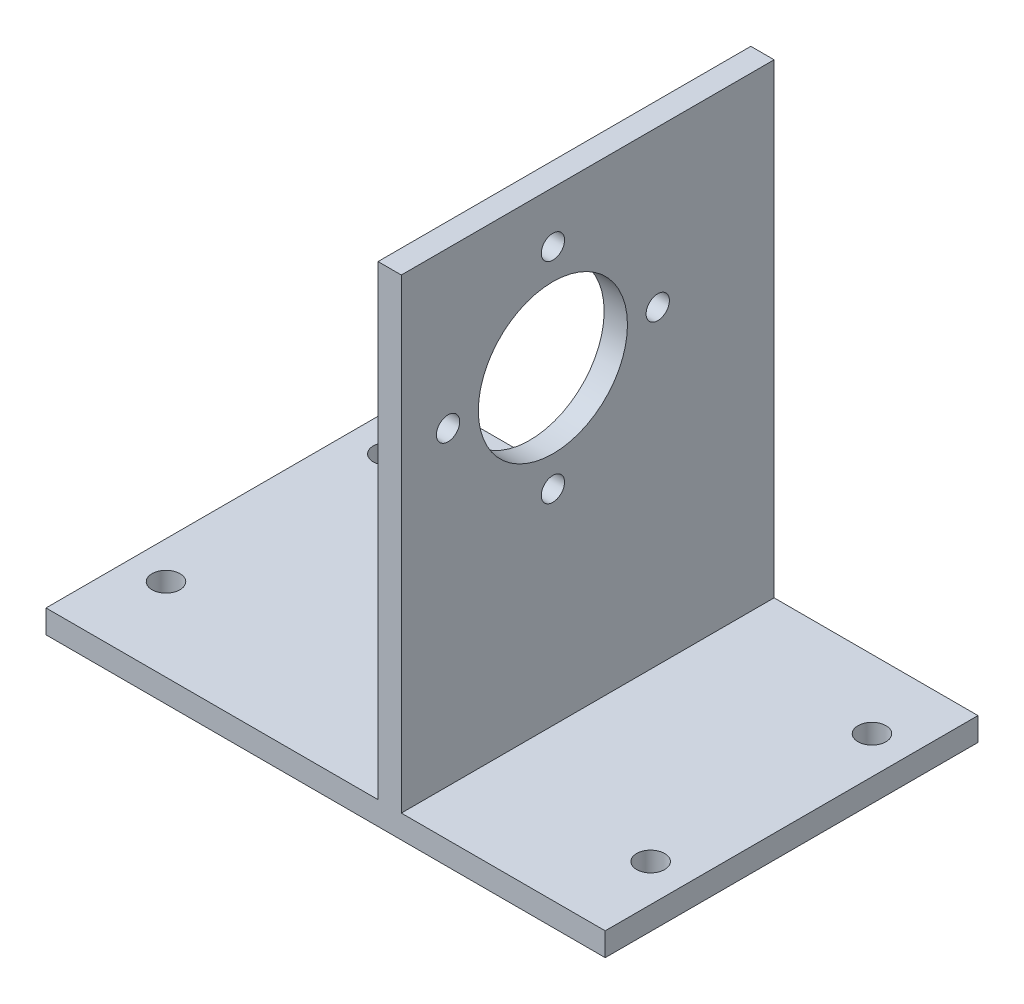
ISO-10303-21;
HEADER;
FILE_DESCRIPTION(('STEP AP214'),'2;1');
FILE_NAME('part.step','',(''),(''),'','','');
FILE_SCHEMA(('AUTOMOTIVE_DESIGN { 1 0 10303 214 1 1 1 1 }'));
ENDSEC;
DATA;
#1=APPLICATION_CONTEXT('core data for automotive mechanical design processes');
#2=APPLICATION_PROTOCOL_DEFINITION('international standard','automotive_design',2000,#1);
#3=PRODUCT_CONTEXT('',#1,'mechanical');
#4=PRODUCT('Part','Part','',(#3));
#5=PRODUCT_RELATED_PRODUCT_CATEGORY('part','',(#4));
#6=PRODUCT_DEFINITION_FORMATION('','',#4);
#7=PRODUCT_DEFINITION_CONTEXT('part definition',#1,'design');
#8=PRODUCT_DEFINITION('design','',#6,#7);
#9=PRODUCT_DEFINITION_SHAPE('','',#8);
#10=(LENGTH_UNIT() NAMED_UNIT(*) SI_UNIT(.MILLI.,.METRE.));
#11=(NAMED_UNIT(*) PLANE_ANGLE_UNIT() SI_UNIT($,.RADIAN.));
#12=(NAMED_UNIT(*) SI_UNIT($,.STERADIAN.) SOLID_ANGLE_UNIT());
#13=UNCERTAINTY_MEASURE_WITH_UNIT(LENGTH_MEASURE(1.E-05),#10,'distance_accuracy_value','');
#14=(GEOMETRIC_REPRESENTATION_CONTEXT(3) GLOBAL_UNCERTAINTY_ASSIGNED_CONTEXT((#13)) GLOBAL_UNIT_ASSIGNED_CONTEXT((#10,
#11,#12)) REPRESENTATION_CONTEXT('',''));
#15=CARTESIAN_POINT('',(0.,0.,0.));
#16=DIRECTION('',(0.,0.,1.));
#17=DIRECTION('',(1.,0.,0.));
#18=AXIS2_PLACEMENT_3D('',#15,#16,#17);
#19=CARTESIAN_POINT('',(0.,5.,0.));
#20=DIRECTION('',(0.,1.,0.));
#21=DIRECTION('',(0.,0.,1.));
#22=AXIS2_PLACEMENT_3D('',#19,#20,#21);
#23=PLANE('',#22);
#24=DIRECTION('',(0.,0.,1.));
#25=VECTOR('',#24,1.);
#26=CARTESIAN_POINT('',(11.25,5.,-40.));
#27=LINE('',#26,#25);
#28=CARTESIAN_POINT('',(11.25,5.,-40.));
#29=VERTEX_POINT('',#28);
#30=CARTESIAN_POINT('',(11.25,5.,40.));
#31=VERTEX_POINT('',#30);
#32=EDGE_CURVE('E49',#29,#31,#27,.T.);
#33=ORIENTED_EDGE('',*,*,#32,.F.);
#34=DIRECTION('',(-1.,0.,0.));
#35=VECTOR('',#34,1.);
#36=CARTESIAN_POINT('',(-60.,5.,-40.));
#37=LINE('',#36,#35);
#38=CARTESIAN_POINT('',(-60.,5.,-40.));
#39=VERTEX_POINT('',#38);
#40=EDGE_CURVE('E159',#29,#39,#37,.T.);
#41=ORIENTED_EDGE('',*,*,#40,.T.);
#42=DIRECTION('',(0.,0.,1.));
#43=VECTOR('',#42,1.);
#44=CARTESIAN_POINT('',(-60.,5.,-40.));
#45=LINE('',#44,#43);
#46=CARTESIAN_POINT('',(-60.,5.,40.));
#47=VERTEX_POINT('',#46);
#48=EDGE_CURVE('E150',#39,#47,#45,.T.);
#49=ORIENTED_EDGE('',*,*,#48,.T.);
#50=DIRECTION('',(1.,0.,0.));
#51=VECTOR('',#50,1.);
#52=CARTESIAN_POINT('',(-60.,5.,40.));
#53=LINE('',#52,#51);
#54=EDGE_CURVE('E155',#47,#31,#53,.T.);
#55=ORIENTED_EDGE('',*,*,#54,.T.);
#56=EDGE_LOOP('',(#33,#41,#49,#55));
#57=FACE_BOUND('',#56,.T.);
#58=CARTESIAN_POINT('',(-52.,5.,22.2499999999999));
#59=DIRECTION('',(0.,1.,0.));
#60=DIRECTION('',(0.,0.,1.));
#61=AXIS2_PLACEMENT_3D('',#58,#59,#60);
#62=CIRCLE('',#61,2.99999999999999);
#63=CARTESIAN_POINT('',(-52.,5.,25.2499999999999));
#64=VERTEX_POINT('',#63);
#65=EDGE_CURVE('E138',#64,#64,#62,.T.);
#66=ORIENTED_EDGE('',*,*,#65,.F.);
#67=EDGE_LOOP('',(#66));
#68=FACE_BOUND('',#67,.T.);
#69=CARTESIAN_POINT('',(-52.,5.,-25.25));
#70=DIRECTION('',(0.,1.,0.));
#71=DIRECTION('',(0.,0.,1.));
#72=AXIS2_PLACEMENT_3D('',#69,#70,#71);
#73=CIRCLE('',#72,3.);
#74=CARTESIAN_POINT('',(-52.,5.,-22.25));
#75=VERTEX_POINT('',#74);
#76=EDGE_CURVE('E144',#75,#75,#73,.T.);
#77=ORIENTED_EDGE('',*,*,#76,.F.);
#78=EDGE_LOOP('',(#77));
#79=FACE_BOUND('',#78,.T.);
#80=ADVANCED_FACE('F32',(#57,#68,#79),#23,.T.);
#81=DIRECTION('',(0.,0.,-1.));
#82=VECTOR('',#81,1.);
#83=CARTESIAN_POINT('',(16.25,5.,-40.));
#84=LINE('',#83,#82);
#85=CARTESIAN_POINT('',(16.25,5.,40.));
#86=VERTEX_POINT('',#85);
#87=CARTESIAN_POINT('',(16.25,5.,-40.));
#88=VERTEX_POINT('',#87);
#89=EDGE_CURVE('E57',#86,#88,#84,.T.);
#90=ORIENTED_EDGE('',*,*,#89,.F.);
#91=CARTESIAN_POINT('',(60.,5.,40.));
#92=VERTEX_POINT('',#91);
#93=EDGE_CURVE('E153',#86,#92,#53,.T.);
#94=ORIENTED_EDGE('',*,*,#93,.T.);
#95=DIRECTION('',(0.,0.,-1.));
#96=VECTOR('',#95,1.);
#97=CARTESIAN_POINT('',(60.,5.,-40.));
#98=LINE('',#97,#96);
#99=CARTESIAN_POINT('',(60.,5.,-40.));
#100=VERTEX_POINT('',#99);
#101=EDGE_CURVE('E157',#92,#100,#98,.T.);
#102=ORIENTED_EDGE('',*,*,#101,.T.);
#103=EDGE_CURVE('E160',#100,#88,#37,.T.);
#104=ORIENTED_EDGE('',*,*,#103,.T.);
#105=EDGE_LOOP('',(#90,#94,#102,#104));
#106=FACE_BOUND('',#105,.T.);
#107=CARTESIAN_POINT('',(52.,5.,22.25));
#108=DIRECTION('',(0.,1.,0.));
#109=DIRECTION('',(0.,0.,1.));
#110=AXIS2_PLACEMENT_3D('',#107,#108,#109);
#111=CIRCLE('',#110,3.00000000000001);
#112=CARTESIAN_POINT('',(52.,5.,25.25));
#113=VERTEX_POINT('',#112);
#114=EDGE_CURVE('E132',#113,#113,#111,.T.);
#115=ORIENTED_EDGE('',*,*,#114,.F.);
#116=EDGE_LOOP('',(#115));
#117=FACE_BOUND('',#116,.T.);
#118=CARTESIAN_POINT('',(52.,5.,-25.2500000000001));
#119=DIRECTION('',(0.,1.,0.));
#120=DIRECTION('',(0.,0.,1.));
#121=AXIS2_PLACEMENT_3D('',#118,#119,#120);
#122=CIRCLE('',#121,3.00000000000001);
#123=CARTESIAN_POINT('',(52.,5.,-22.25));
#124=VERTEX_POINT('',#123);
#125=EDGE_CURVE('E123',#124,#124,#122,.T.);
#126=ORIENTED_EDGE('',*,*,#125,.F.);
#127=EDGE_LOOP('',(#126));
#128=FACE_BOUND('',#127,.T.);
#129=ADVANCED_FACE('F231',(#106,#117,#128),#23,.T.);
#130=CARTESIAN_POINT('',(0.,0.,0.));
#131=DIRECTION('',(0.,1.,0.));
#132=DIRECTION('',(0.,0.,1.));
#133=AXIS2_PLACEMENT_3D('',#130,#131,#132);
#134=PLANE('',#133);
#135=DIRECTION('',(0.,0.,1.));
#136=VECTOR('',#135,1.);
#137=CARTESIAN_POINT('',(-60.,0.,-40.));
#138=LINE('',#137,#136);
#139=CARTESIAN_POINT('',(-60.,0.,-40.));
#140=VERTEX_POINT('',#139);
#141=CARTESIAN_POINT('',(-60.,0.,40.));
#142=VERTEX_POINT('',#141);
#143=EDGE_CURVE('E147',#140,#142,#138,.T.);
#144=ORIENTED_EDGE('',*,*,#143,.F.);
#145=DIRECTION('',(-1.,0.,0.));
#146=VECTOR('',#145,1.);
#147=CARTESIAN_POINT('',(-60.,0.,-40.));
#148=LINE('',#147,#146);
#149=CARTESIAN_POINT('',(60.,0.,-40.));
#150=VERTEX_POINT('',#149);
#151=EDGE_CURVE('E154',#150,#140,#148,.T.);
#152=ORIENTED_EDGE('',*,*,#151,.F.);
#153=DIRECTION('',(0.,0.,-1.));
#154=VECTOR('',#153,1.);
#155=CARTESIAN_POINT('',(60.,0.,-40.));
#156=LINE('',#155,#154);
#157=CARTESIAN_POINT('',(60.,0.,40.));
#158=VERTEX_POINT('',#157);
#159=EDGE_CURVE('E167',#158,#150,#156,.T.);
#160=ORIENTED_EDGE('',*,*,#159,.F.);
#161=DIRECTION('',(1.,0.,0.));
#162=VECTOR('',#161,1.);
#163=CARTESIAN_POINT('',(-60.,0.,40.));
#164=LINE('',#163,#162);
#165=EDGE_CURVE('E165',#142,#158,#164,.T.);
#166=ORIENTED_EDGE('',*,*,#165,.F.);
#167=EDGE_LOOP('',(#144,#152,#160,#166));
#168=FACE_BOUND('',#167,.T.);
#169=CARTESIAN_POINT('',(-52.,0.,-25.25));
#170=DIRECTION('',(0.,1.,0.));
#171=DIRECTION('',(0.,0.,1.));
#172=AXIS2_PLACEMENT_3D('',#169,#170,#171);
#173=CIRCLE('',#172,3.);
#174=CARTESIAN_POINT('',(-52.,0.,-22.25));
#175=VERTEX_POINT('',#174);
#176=EDGE_CURVE('E141',#175,#175,#173,.T.);
#177=ORIENTED_EDGE('',*,*,#176,.T.);
#178=EDGE_LOOP('',(#177));
#179=FACE_BOUND('',#178,.T.);
#180=CARTESIAN_POINT('',(-52.,0.,22.2499999999999));
#181=DIRECTION('',(0.,1.,0.));
#182=DIRECTION('',(0.,0.,1.));
#183=AXIS2_PLACEMENT_3D('',#180,#181,#182);
#184=CIRCLE('',#183,2.99999999999999);
#185=CARTESIAN_POINT('',(-52.,0.,25.2499999999999));
#186=VERTEX_POINT('',#185);
#187=EDGE_CURVE('E135',#186,#186,#184,.T.);
#188=ORIENTED_EDGE('',*,*,#187,.T.);
#189=EDGE_LOOP('',(#188));
#190=FACE_BOUND('',#189,.T.);
#191=CARTESIAN_POINT('',(52.,0.,22.25));
#192=DIRECTION('',(0.,1.,0.));
#193=DIRECTION('',(0.,0.,1.));
#194=AXIS2_PLACEMENT_3D('',#191,#192,#193);
#195=CIRCLE('',#194,3.00000000000001);
#196=CARTESIAN_POINT('',(52.,0.,25.25));
#197=VERTEX_POINT('',#196);
#198=EDGE_CURVE('E130',#197,#197,#195,.T.);
#199=ORIENTED_EDGE('',*,*,#198,.T.);
#200=EDGE_LOOP('',(#199));
#201=FACE_BOUND('',#200,.T.);
#202=CARTESIAN_POINT('',(52.,0.,-25.2500000000001));
#203=DIRECTION('',(0.,1.,0.));
#204=DIRECTION('',(0.,0.,1.));
#205=AXIS2_PLACEMENT_3D('',#202,#203,#204);
#206=CIRCLE('',#205,3.00000000000001);
#207=CARTESIAN_POINT('',(52.,0.,-22.25));
#208=VERTEX_POINT('',#207);
#209=EDGE_CURVE('E120',#208,#208,#206,.T.);
#210=ORIENTED_EDGE('',*,*,#209,.T.);
#211=EDGE_LOOP('',(#210));
#212=FACE_BOUND('',#211,.T.);
#213=ADVANCED_FACE('F236',(#168,#179,#190,#201,#212),#134,.F.);
#214=CARTESIAN_POINT('',(-60.,5.,-40.));
#215=DIRECTION('',(1.,0.,0.));
#216=DIRECTION('',(0.,0.,-1.));
#217=AXIS2_PLACEMENT_3D('',#214,#215,#216);
#218=PLANE('',#217);
#219=ORIENTED_EDGE('',*,*,#143,.T.);
#220=DIRECTION('',(0.,-1.,0.));
#221=VECTOR('',#220,1.);
#222=CARTESIAN_POINT('',(-60.,5.,40.));
#223=LINE('',#222,#221);
#224=EDGE_CURVE('E11',#47,#142,#223,.T.);
#225=ORIENTED_EDGE('',*,*,#224,.F.);
#226=ORIENTED_EDGE('',*,*,#48,.F.);
#227=DIRECTION('',(0.,-1.,0.));
#228=VECTOR('',#227,1.);
#229=CARTESIAN_POINT('',(-60.,5.,-40.));
#230=LINE('',#229,#228);
#231=EDGE_CURVE('E162',#39,#140,#230,.T.);
#232=ORIENTED_EDGE('',*,*,#231,.T.);
#233=EDGE_LOOP('',(#219,#225,#226,#232));
#234=FACE_BOUND('',#233,.T.);
#235=ADVANCED_FACE('F34',(#234),#218,.F.);
#236=CARTESIAN_POINT('',(-60.,5.,40.));
#237=DIRECTION('',(0.,0.,-1.));
#238=DIRECTION('',(-1.,0.,0.));
#239=AXIS2_PLACEMENT_3D('',#236,#237,#238);
#240=PLANE('',#239);
#241=ORIENTED_EDGE('',*,*,#165,.T.);
#242=DIRECTION('',(0.,-1.,0.));
#243=VECTOR('',#242,1.);
#244=CARTESIAN_POINT('',(60.,5.,40.));
#245=LINE('',#244,#243);
#246=EDGE_CURVE('E41',#92,#158,#245,.T.);
#247=ORIENTED_EDGE('',*,*,#246,.F.);
#248=ORIENTED_EDGE('',*,*,#93,.F.);
#249=DIRECTION('',(0.,-1.,0.));
#250=VECTOR('',#249,1.);
#251=CARTESIAN_POINT('',(16.25,105.,40.));
#252=LINE('',#251,#250);
#253=CARTESIAN_POINT('',(16.25,105.,40.));
#254=VERTEX_POINT('',#253);
#255=EDGE_CURVE('E105',#254,#86,#252,.T.);
#256=ORIENTED_EDGE('',*,*,#255,.F.);
#257=DIRECTION('',(1.,0.,0.));
#258=VECTOR('',#257,1.);
#259=CARTESIAN_POINT('',(11.25,105.,40.));
#260=LINE('',#259,#258);
#261=CARTESIAN_POINT('',(11.25,105.,40.));
#262=VERTEX_POINT('',#261);
#263=EDGE_CURVE('E99',#262,#254,#260,.T.);
#264=ORIENTED_EDGE('',*,*,#263,.F.);
#265=DIRECTION('',(0.,-1.,0.));
#266=VECTOR('',#265,1.);
#267=CARTESIAN_POINT('',(11.25,105.,40.));
#268=LINE('',#267,#266);
#269=EDGE_CURVE('E103',#262,#31,#268,.T.);
#270=ORIENTED_EDGE('',*,*,#269,.T.);
#271=ORIENTED_EDGE('',*,*,#54,.F.);
#272=ORIENTED_EDGE('',*,*,#224,.T.);
#273=EDGE_LOOP('',(#241,#247,#248,#256,#264,#270,#271,#272));
#274=FACE_BOUND('',#273,.T.);
#275=ADVANCED_FACE('F101',(#274),#240,.F.);
#276=CARTESIAN_POINT('',(60.,5.,-40.));
#277=DIRECTION('',(-1.,0.,0.));
#278=DIRECTION('',(0.,0.,1.));
#279=AXIS2_PLACEMENT_3D('',#276,#277,#278);
#280=PLANE('',#279);
#281=ORIENTED_EDGE('',*,*,#159,.T.);
#282=DIRECTION('',(0.,-1.,0.));
#283=VECTOR('',#282,1.);
#284=CARTESIAN_POINT('',(60.,5.,-40.));
#285=LINE('',#284,#283);
#286=EDGE_CURVE('E172',#100,#150,#285,.T.);
#287=ORIENTED_EDGE('',*,*,#286,.F.);
#288=ORIENTED_EDGE('',*,*,#101,.F.);
#289=ORIENTED_EDGE('',*,*,#246,.T.);
#290=EDGE_LOOP('',(#281,#287,#288,#289));
#291=FACE_BOUND('',#290,.T.);
#292=ADVANCED_FACE('F247',(#291),#280,.F.);
#293=CARTESIAN_POINT('',(-60.,5.,-40.));
#294=DIRECTION('',(0.,0.,1.));
#295=DIRECTION('',(1.,0.,0.));
#296=AXIS2_PLACEMENT_3D('',#293,#294,#295);
#297=PLANE('',#296);
#298=ORIENTED_EDGE('',*,*,#151,.T.);
#299=ORIENTED_EDGE('',*,*,#231,.F.);
#300=ORIENTED_EDGE('',*,*,#40,.F.);
#301=DIRECTION('',(0.,-1.,0.));
#302=VECTOR('',#301,1.);
#303=CARTESIAN_POINT('',(11.25,105.,-40.));
#304=LINE('',#303,#302);
#305=CARTESIAN_POINT('',(11.25,105.,-40.));
#306=VERTEX_POINT('',#305);
#307=EDGE_CURVE('E207',#306,#29,#304,.T.);
#308=ORIENTED_EDGE('',*,*,#307,.F.);
#309=DIRECTION('',(-1.,0.,0.));
#310=VECTOR('',#309,1.);
#311=CARTESIAN_POINT('',(11.25,105.,-40.));
#312=LINE('',#311,#310);
#313=CARTESIAN_POINT('',(16.25,105.,-40.));
#314=VERTEX_POINT('',#313);
#315=EDGE_CURVE('E114',#314,#306,#312,.T.);
#316=ORIENTED_EDGE('',*,*,#315,.F.);
#317=DIRECTION('',(0.,-1.,0.));
#318=VECTOR('',#317,1.);
#319=CARTESIAN_POINT('',(16.25,105.,-40.));
#320=LINE('',#319,#318);
#321=EDGE_CURVE('E125',#314,#88,#320,.T.);
#322=ORIENTED_EDGE('',*,*,#321,.T.);
#323=ORIENTED_EDGE('',*,*,#103,.F.);
#324=ORIENTED_EDGE('',*,*,#286,.T.);
#325=EDGE_LOOP('',(#298,#299,#300,#308,#316,#322,#323,#324));
#326=FACE_BOUND('',#325,.T.);
#327=ADVANCED_FACE('F214',(#326),#297,.F.);
#328=CARTESIAN_POINT('',(-52.,5.,-25.25));
#329=DIRECTION('',(0.,-1.,0.));
#330=DIRECTION('',(0.,0.,-1.));
#331=AXIS2_PLACEMENT_3D('',#328,#329,#330);
#332=CYLINDRICAL_SURFACE('',#331,3.);
#333=ORIENTED_EDGE('',*,*,#76,.T.);
#334=EDGE_LOOP('',(#333));
#335=FACE_BOUND('',#334,.T.);
#336=ORIENTED_EDGE('',*,*,#176,.F.);
#337=EDGE_LOOP('',(#336));
#338=FACE_BOUND('',#337,.T.);
#339=ADVANCED_FACE('F240',(#335,#338),#332,.F.);
#340=CARTESIAN_POINT('',(-52.,5.,22.2499999999999));
#341=DIRECTION('',(0.,-1.,0.));
#342=DIRECTION('',(0.,0.,-1.));
#343=AXIS2_PLACEMENT_3D('',#340,#341,#342);
#344=CYLINDRICAL_SURFACE('',#343,2.99999999999999);
#345=ORIENTED_EDGE('',*,*,#65,.T.);
#346=EDGE_LOOP('',(#345));
#347=FACE_BOUND('',#346,.T.);
#348=ORIENTED_EDGE('',*,*,#187,.F.);
#349=EDGE_LOOP('',(#348));
#350=FACE_BOUND('',#349,.T.);
#351=ADVANCED_FACE('F281',(#347,#350),#344,.F.);
#352=CARTESIAN_POINT('',(52.,5.,22.25));
#353=DIRECTION('',(0.,-1.,0.));
#354=DIRECTION('',(0.,0.,-1.));
#355=AXIS2_PLACEMENT_3D('',#352,#353,#354);
#356=CYLINDRICAL_SURFACE('',#355,3.00000000000001);
#357=ORIENTED_EDGE('',*,*,#114,.T.);
#358=EDGE_LOOP('',(#357));
#359=FACE_BOUND('',#358,.T.);
#360=ORIENTED_EDGE('',*,*,#198,.F.);
#361=EDGE_LOOP('',(#360));
#362=FACE_BOUND('',#361,.T.);
#363=ADVANCED_FACE('F274',(#359,#362),#356,.F.);
#364=CARTESIAN_POINT('',(52.,5.,-25.2500000000001));
#365=DIRECTION('',(0.,-1.,0.));
#366=DIRECTION('',(0.,0.,-1.));
#367=AXIS2_PLACEMENT_3D('',#364,#365,#366);
#368=CYLINDRICAL_SURFACE('',#367,3.00000000000001);
#369=ORIENTED_EDGE('',*,*,#125,.T.);
#370=EDGE_LOOP('',(#369));
#371=FACE_BOUND('',#370,.T.);
#372=ORIENTED_EDGE('',*,*,#209,.F.);
#373=EDGE_LOOP('',(#372));
#374=FACE_BOUND('',#373,.T.);
#375=ADVANCED_FACE('F226',(#371,#374),#368,.F.);
#376=CARTESIAN_POINT('',(11.25,105.,-40.));
#377=DIRECTION('',(1.,0.,0.));
#378=DIRECTION('',(0.,0.,-1.));
#379=AXIS2_PLACEMENT_3D('',#376,#377,#378);
#380=PLANE('',#379);
#381=CARTESIAN_POINT('',(11.25,71.4999999999999,29.9738001027061));
#382=DIRECTION('',(1.,0.,0.));
#383=DIRECTION('',(0.,0.,-1.));
#384=AXIS2_PLACEMENT_3D('',#381,#382,#383);
#385=CIRCLE('',#384,2.5);
#386=CARTESIAN_POINT('',(11.25,71.4999999999999,27.4738001027061));
#387=VERTEX_POINT('',#386);
#388=EDGE_CURVE('E202',#387,#387,#385,.T.);
#389=ORIENTED_EDGE('',*,*,#388,.T.);
#390=EDGE_LOOP('',(#389));
#391=FACE_BOUND('',#390,.T.);
#392=CARTESIAN_POINT('',(11.25,71.5000000000002,-15.0261998972939));
#393=DIRECTION('',(1.,0.,0.));
#394=DIRECTION('',(0.,0.,-1.));
#395=AXIS2_PLACEMENT_3D('',#392,#393,#394);
#396=CIRCLE('',#395,2.5);
#397=CARTESIAN_POINT('',(11.25,71.5000000000002,-17.5261998972939));
#398=VERTEX_POINT('',#397);
#399=EDGE_CURVE('E190',#398,#398,#396,.T.);
#400=ORIENTED_EDGE('',*,*,#399,.T.);
#401=EDGE_LOOP('',(#400));
#402=FACE_BOUND('',#401,.T.);
#403=CARTESIAN_POINT('',(11.25,49.,7.47380010270592));
#404=DIRECTION('',(1.,0.,0.));
#405=DIRECTION('',(0.,0.,-1.));
#406=AXIS2_PLACEMENT_3D('',#403,#404,#405);
#407=CIRCLE('',#406,2.5);
#408=CARTESIAN_POINT('',(11.25,49.,4.97380010270592));
#409=VERTEX_POINT('',#408);
#410=EDGE_CURVE('E187',#409,#409,#407,.T.);
#411=ORIENTED_EDGE('',*,*,#410,.T.);
#412=EDGE_LOOP('',(#411));
#413=FACE_BOUND('',#412,.T.);
#414=CARTESIAN_POINT('',(11.25,94.,7.47380010270609));
#415=DIRECTION('',(1.,0.,0.));
#416=DIRECTION('',(0.,0.,-1.));
#417=AXIS2_PLACEMENT_3D('',#414,#415,#416);
#418=CIRCLE('',#417,2.5);
#419=CARTESIAN_POINT('',(11.25,94.,4.97380010270609));
#420=VERTEX_POINT('',#419);
#421=EDGE_CURVE('E184',#420,#420,#418,.T.);
#422=ORIENTED_EDGE('',*,*,#421,.T.);
#423=EDGE_LOOP('',(#422));
#424=FACE_BOUND('',#423,.T.);
#425=CARTESIAN_POINT('',(11.25,71.5,7.47380010270608));
#426=DIRECTION('',(1.,0.,0.));
#427=DIRECTION('',(0.,0.,-1.));
#428=AXIS2_PLACEMENT_3D('',#425,#426,#427);
#429=CIRCLE('',#428,16.);
#430=CARTESIAN_POINT('',(11.25,71.5,-8.52619989729392));
#431=VERTEX_POINT('',#430);
#432=EDGE_CURVE('E180',#431,#431,#429,.T.);
#433=ORIENTED_EDGE('',*,*,#432,.T.);
#434=EDGE_LOOP('',(#433));
#435=FACE_BOUND('',#434,.T.);
#436=ORIENTED_EDGE('',*,*,#32,.T.);
#437=ORIENTED_EDGE('',*,*,#269,.F.);
#438=DIRECTION('',(0.,0.,1.));
#439=VECTOR('',#438,1.);
#440=CARTESIAN_POINT('',(11.25,105.,-40.));
#441=LINE('',#440,#439);
#442=EDGE_CURVE('E109',#306,#262,#441,.T.);
#443=ORIENTED_EDGE('',*,*,#442,.F.);
#444=ORIENTED_EDGE('',*,*,#307,.T.);
#445=EDGE_LOOP('',(#436,#437,#443,#444));
#446=FACE_BOUND('',#445,.T.);
#447=ADVANCED_FACE('F119',(#391,#402,#413,#424,#435,#446),#380,.F.);
#448=CARTESIAN_POINT('',(16.25,105.,-40.));
#449=DIRECTION('',(-1.,0.,0.));
#450=DIRECTION('',(0.,0.,1.));
#451=AXIS2_PLACEMENT_3D('',#448,#449,#450);
#452=PLANE('',#451);
#453=CARTESIAN_POINT('',(16.25,71.4999999999999,29.9738001027061));
#454=DIRECTION('',(-1.,0.,0.));
#455=DIRECTION('',(0.,0.,1.));
#456=AXIS2_PLACEMENT_3D('',#453,#454,#455);
#457=CIRCLE('',#456,2.5);
#458=CARTESIAN_POINT('',(16.25,71.4999999999999,32.4738001027061));
#459=VERTEX_POINT('',#458);
#460=EDGE_CURVE('E36',#459,#459,#457,.T.);
#461=ORIENTED_EDGE('',*,*,#460,.T.);
#462=EDGE_LOOP('',(#461));
#463=FACE_BOUND('',#462,.T.);
#464=CARTESIAN_POINT('',(16.25,71.5000000000002,-15.0261998972939));
#465=DIRECTION('',(-1.,0.,0.));
#466=DIRECTION('',(0.,0.,1.));
#467=AXIS2_PLACEMENT_3D('',#464,#465,#466);
#468=CIRCLE('',#467,2.5);
#469=CARTESIAN_POINT('',(16.25,71.5000000000002,-12.5261998972939));
#470=VERTEX_POINT('',#469);
#471=EDGE_CURVE('E188',#470,#470,#468,.T.);
#472=ORIENTED_EDGE('',*,*,#471,.T.);
#473=EDGE_LOOP('',(#472));
#474=FACE_BOUND('',#473,.T.);
#475=CARTESIAN_POINT('',(16.25,49.,7.47380010270592));
#476=DIRECTION('',(-1.,0.,0.));
#477=DIRECTION('',(0.,0.,1.));
#478=AXIS2_PLACEMENT_3D('',#475,#476,#477);
#479=CIRCLE('',#478,2.5);
#480=CARTESIAN_POINT('',(16.25,49.,9.97380010270592));
#481=VERTEX_POINT('',#480);
#482=EDGE_CURVE('E185',#481,#481,#479,.T.);
#483=ORIENTED_EDGE('',*,*,#482,.T.);
#484=EDGE_LOOP('',(#483));
#485=FACE_BOUND('',#484,.T.);
#486=CARTESIAN_POINT('',(16.25,94.,7.47380010270608));
#487=DIRECTION('',(-1.,0.,0.));
#488=DIRECTION('',(0.,0.,1.));
#489=AXIS2_PLACEMENT_3D('',#486,#487,#488);
#490=CIRCLE('',#489,2.5);
#491=CARTESIAN_POINT('',(16.25,94.,9.97380010270608));
#492=VERTEX_POINT('',#491);
#493=EDGE_CURVE('E181',#492,#492,#490,.T.);
#494=ORIENTED_EDGE('',*,*,#493,.T.);
#495=EDGE_LOOP('',(#494));
#496=FACE_BOUND('',#495,.T.);
#497=CARTESIAN_POINT('',(16.25,71.5,7.47380010270608));
#498=DIRECTION('',(-1.,0.,0.));
#499=DIRECTION('',(0.,0.,1.));
#500=AXIS2_PLACEMENT_3D('',#497,#498,#499);
#501=CIRCLE('',#500,16.);
#502=CARTESIAN_POINT('',(16.25,71.5,23.4738001027061));
#503=VERTEX_POINT('',#502);
#504=EDGE_CURVE('E177',#503,#503,#501,.T.);
#505=ORIENTED_EDGE('',*,*,#504,.T.);
#506=EDGE_LOOP('',(#505));
#507=FACE_BOUND('',#506,.T.);
#508=ORIENTED_EDGE('',*,*,#89,.T.);
#509=ORIENTED_EDGE('',*,*,#321,.F.);
#510=DIRECTION('',(0.,0.,-1.));
#511=VECTOR('',#510,1.);
#512=CARTESIAN_POINT('',(16.25,105.,-40.));
#513=LINE('',#512,#511);
#514=EDGE_CURVE('E108',#254,#314,#513,.T.);
#515=ORIENTED_EDGE('',*,*,#514,.F.);
#516=ORIENTED_EDGE('',*,*,#255,.T.);
#517=EDGE_LOOP('',(#508,#509,#515,#516));
#518=FACE_BOUND('',#517,.T.);
#519=ADVANCED_FACE('F216',(#463,#474,#485,#496,#507,#518),#452,.F.);
#520=CARTESIAN_POINT('',(0.,105.,0.));
#521=DIRECTION('',(0.,1.,0.));
#522=DIRECTION('',(0.,0.,1.));
#523=AXIS2_PLACEMENT_3D('',#520,#521,#522);
#524=PLANE('',#523);
#525=ORIENTED_EDGE('',*,*,#442,.T.);
#526=ORIENTED_EDGE('',*,*,#263,.T.);
#527=ORIENTED_EDGE('',*,*,#514,.T.);
#528=ORIENTED_EDGE('',*,*,#315,.T.);
#529=EDGE_LOOP('',(#525,#526,#527,#528));
#530=FACE_BOUND('',#529,.T.);
#531=ADVANCED_FACE('F112',(#530),#524,.T.);
#532=CARTESIAN_POINT('',(-60.,71.5,7.47380010270609));
#533=DIRECTION('',(1.,0.,0.));
#534=DIRECTION('',(0.,0.,-1.));
#535=AXIS2_PLACEMENT_3D('',#532,#533,#534);
#536=CYLINDRICAL_SURFACE('',#535,16.);
#537=ORIENTED_EDGE('',*,*,#504,.F.);
#538=EDGE_LOOP('',(#537));
#539=FACE_BOUND('',#538,.T.);
#540=ORIENTED_EDGE('',*,*,#432,.F.);
#541=EDGE_LOOP('',(#540));
#542=FACE_BOUND('',#541,.T.);
#543=ADVANCED_FACE('F224',(#539,#542),#536,.F.);
#544=CARTESIAN_POINT('',(-60.,94.,7.47380010270609));
#545=DIRECTION('',(1.,0.,0.));
#546=DIRECTION('',(0.,0.,-1.));
#547=AXIS2_PLACEMENT_3D('',#544,#545,#546);
#548=CYLINDRICAL_SURFACE('',#547,2.5);
#549=ORIENTED_EDGE('',*,*,#493,.F.);
#550=EDGE_LOOP('',(#549));
#551=FACE_BOUND('',#550,.T.);
#552=ORIENTED_EDGE('',*,*,#421,.F.);
#553=EDGE_LOOP('',(#552));
#554=FACE_BOUND('',#553,.T.);
#555=ADVANCED_FACE('F368',(#551,#554),#548,.F.);
#556=CARTESIAN_POINT('',(-60.,49.,7.47380010270593));
#557=DIRECTION('',(1.,0.,0.));
#558=DIRECTION('',(0.,0.,-1.));
#559=AXIS2_PLACEMENT_3D('',#556,#557,#558);
#560=CYLINDRICAL_SURFACE('',#559,2.5);
#561=ORIENTED_EDGE('',*,*,#482,.F.);
#562=EDGE_LOOP('',(#561));
#563=FACE_BOUND('',#562,.T.);
#564=ORIENTED_EDGE('',*,*,#410,.F.);
#565=EDGE_LOOP('',(#564));
#566=FACE_BOUND('',#565,.T.);
#567=ADVANCED_FACE('F377',(#563,#566),#560,.F.);
#568=CARTESIAN_POINT('',(-60.,71.5000000000002,-15.0261998972939));
#569=DIRECTION('',(1.,0.,0.));
#570=DIRECTION('',(0.,0.,-1.));
#571=AXIS2_PLACEMENT_3D('',#568,#569,#570);
#572=CYLINDRICAL_SURFACE('',#571,2.5);
#573=ORIENTED_EDGE('',*,*,#471,.F.);
#574=EDGE_LOOP('',(#573));
#575=FACE_BOUND('',#574,.T.);
#576=ORIENTED_EDGE('',*,*,#399,.F.);
#577=EDGE_LOOP('',(#576));
#578=FACE_BOUND('',#577,.T.);
#579=ADVANCED_FACE('F386',(#575,#578),#572,.F.);
#580=CARTESIAN_POINT('',(-60.,71.4999999999999,29.9738001027061));
#581=DIRECTION('',(1.,0.,0.));
#582=DIRECTION('',(0.,0.,-1.));
#583=AXIS2_PLACEMENT_3D('',#580,#581,#582);
#584=CYLINDRICAL_SURFACE('',#583,2.5);
#585=ORIENTED_EDGE('',*,*,#460,.F.);
#586=EDGE_LOOP('',(#585));
#587=FACE_BOUND('',#586,.T.);
#588=ORIENTED_EDGE('',*,*,#388,.F.);
#589=EDGE_LOOP('',(#588));
#590=FACE_BOUND('',#589,.T.);
#591=ADVANCED_FACE('F395',(#587,#590),#584,.F.);
#592=CLOSED_SHELL('',(#80,#129,#213,#235,#275,#292,#327,#339,#351,#363,#375,#447,#519,#531,#543,
#555,#567,#579,#591));
#593=MANIFOLD_SOLID_BREP('B2',#592);
#594=ADVANCED_BREP_SHAPE_REPRESENTATION('',(#18,#593),#14);
#595=SHAPE_DEFINITION_REPRESENTATION(#9,#594);
ENDSEC;
END-ISO-10303-21;
